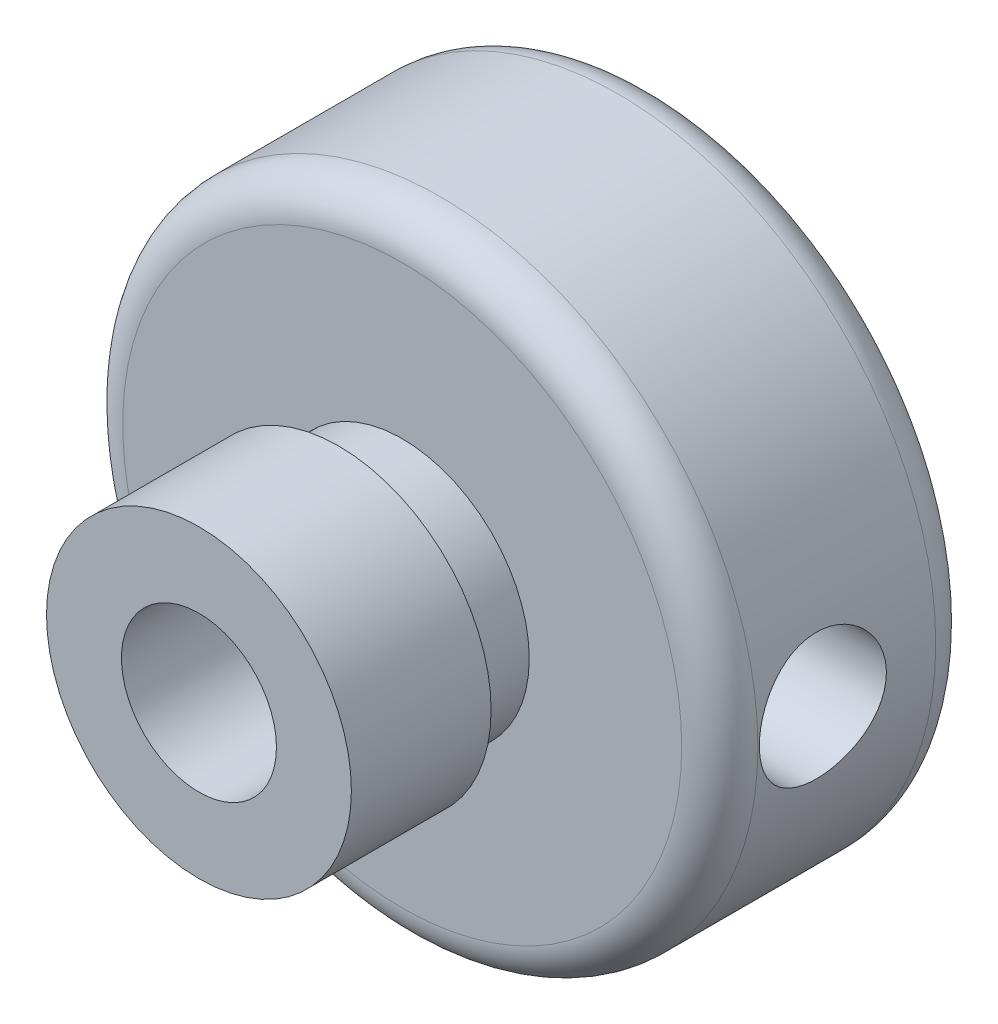
ISO-10303-21;
HEADER;
FILE_DESCRIPTION(('STEP AP214'),'2;1');
FILE_NAME('part.step','',(''),(''),'','','');
FILE_SCHEMA(('AUTOMOTIVE_DESIGN { 1 0 10303 214 1 1 1 1 }'));
ENDSEC;
DATA;
#1=APPLICATION_CONTEXT('core data for automotive mechanical design processes');
#2=APPLICATION_PROTOCOL_DEFINITION('international standard','automotive_design',2000,#1);
#3=PRODUCT_CONTEXT('',#1,'mechanical');
#4=PRODUCT('Part','Part','',(#3));
#5=PRODUCT_RELATED_PRODUCT_CATEGORY('part','',(#4));
#6=PRODUCT_DEFINITION_FORMATION('','',#4);
#7=PRODUCT_DEFINITION_CONTEXT('part definition',#1,'design');
#8=PRODUCT_DEFINITION('design','',#6,#7);
#9=PRODUCT_DEFINITION_SHAPE('','',#8);
#10=(LENGTH_UNIT() NAMED_UNIT(*) SI_UNIT(.MILLI.,.METRE.));
#11=(NAMED_UNIT(*) PLANE_ANGLE_UNIT() SI_UNIT($,.RADIAN.));
#12=(NAMED_UNIT(*) SI_UNIT($,.STERADIAN.) SOLID_ANGLE_UNIT());
#13=UNCERTAINTY_MEASURE_WITH_UNIT(LENGTH_MEASURE(1.E-05),#10,'distance_accuracy_value','');
#14=(GEOMETRIC_REPRESENTATION_CONTEXT(3) GLOBAL_UNCERTAINTY_ASSIGNED_CONTEXT((#13)) GLOBAL_UNIT_ASSIGNED_CONTEXT((#10,
#11,#12)) REPRESENTATION_CONTEXT('',''));
#15=CARTESIAN_POINT('',(0.,0.,0.));
#16=DIRECTION('',(0.,0.,1.));
#17=DIRECTION('',(1.,0.,0.));
#18=AXIS2_PLACEMENT_3D('',#15,#16,#17);
#19=CARTESIAN_POINT('',(0.,0.,0.));
#20=DIRECTION('',(0.,0.,1.));
#21=DIRECTION('',(1.,0.,0.));
#22=AXIS2_PLACEMENT_3D('',#19,#20,#21);
#23=CYLINDRICAL_SURFACE('',#22,3.05);
#24=CARTESIAN_POINT('',(0.,0.,18.));
#25=DIRECTION('',(0.,0.,1.));
#26=DIRECTION('',(1.,0.,0.));
#27=AXIS2_PLACEMENT_3D('',#24,#25,#26);
#28=CIRCLE('',#27,3.05);
#29=CARTESIAN_POINT('',(3.05,0.,18.));
#30=VERTEX_POINT('',#29);
#31=EDGE_CURVE('E133',#30,#30,#28,.T.);
#32=ORIENTED_EDGE('',*,*,#31,.T.);
#33=EDGE_LOOP('',(#32));
#34=FACE_BOUND('',#33,.T.);
#35=CARTESIAN_POINT('',(0.,0.,8.00000000000001));
#36=DIRECTION('',(0.,0.,-1.));
#37=DIRECTION('',(-1.,0.,0.));
#38=AXIS2_PLACEMENT_3D('',#35,#36,#37);
#39=CIRCLE('',#38,3.05);
#40=CARTESIAN_POINT('',(-3.05,0.,8.00000000000001));
#41=VERTEX_POINT('',#40);
#42=EDGE_CURVE('E132',#41,#41,#39,.F.);
#43=ORIENTED_EDGE('',*,*,#42,.F.);
#44=EDGE_LOOP('',(#43));
#45=FACE_BOUND('',#44,.T.);
#46=ADVANCED_FACE('F33',(#34,#45),#23,.F.);
#47=CARTESIAN_POINT('',(0.,0.,9.99999999999998));
#48=DIRECTION('',(0.,0.,-1.));
#49=DIRECTION('',(-1.,0.,0.));
#50=AXIS2_PLACEMENT_3D('',#47,#48,#49);
#51=CYLINDRICAL_SURFACE('',#50,12.5);
#52=CARTESIAN_POINT('',(12.5,0.,3.44238683127573));
#53=CARTESIAN_POINT('',(12.4999974395217,-0.138942266981648,3.4423919425216));
#54=CARTESIAN_POINT('',(12.4976596294558,-0.27794915050388,3.45400893869483));
#55=CARTESIAN_POINT('',(12.4885591405808,-0.552033769222637,3.50013308156382));
#56=CARTESIAN_POINT('',(12.4817929465046,-0.687108293853483,3.53465841327949));
#57=CARTESIAN_POINT('',(12.4645912319571,-0.949325763158384,3.6254900153277));
#58=CARTESIAN_POINT('',(12.4541592269179,-1.07647616983294,3.68177542338744));
#59=CARTESIAN_POINT('',(12.4307599508829,-1.31951997216066,3.81446745005396));
#60=CARTESIAN_POINT('',(12.4177928308927,-1.43541403768961,3.89087287029375));
#61=CARTESIAN_POINT('',(12.3905541332493,-1.65423369328724,4.06273306700431));
#62=CARTESIAN_POINT('',(12.3762686376087,-1.75698487789641,4.1584077197537));
#63=CARTESIAN_POINT('',(12.3481045113147,-1.94509189152012,4.36561787225496));
#64=CARTESIAN_POINT('',(12.3342259125106,-2.03044636192605,4.47715460961353));
#65=CARTESIAN_POINT('',(12.3083110453154,-2.18207938336905,4.71417731380543));
#66=CARTESIAN_POINT('',(12.2962926841237,-2.24817734716474,4.8397809407666));
#67=CARTESIAN_POINT('',(12.2756567014604,-2.35826416645085,5.10059137878589));
#68=CARTESIAN_POINT('',(12.267038744049,-2.40225520609312,5.23579723964158));
#69=CARTESIAN_POINT('',(12.2543201313051,-2.46631324971209,5.51009774104552));
#70=CARTESIAN_POINT('',(12.2501617526797,-2.48668624489703,5.64911819163129));
#71=CARTESIAN_POINT('',(12.2466593765157,-2.50388031931538,5.92866138468657));
#72=CARTESIAN_POINT('',(12.247314886696,-2.50070380678376,6.06918397207609));
#73=CARTESIAN_POINT('',(12.2533137787046,-2.47113643275455,6.34550380132824));
#74=CARTESIAN_POINT('',(12.2585863214691,-2.44509635060982,6.48134034534402));
#75=CARTESIAN_POINT('',(12.273113654,-2.37109471155772,6.74667702293324));
#76=CARTESIAN_POINT('',(12.2823686339444,-2.32313210775179,6.87617685357325));
#77=CARTESIAN_POINT('',(12.3038904625101,-2.20631195918688,7.12617498553472));
#78=CARTESIAN_POINT('',(12.3161772453426,-2.13731537808036,7.24660653019865));
#79=CARTESIAN_POINT('',(12.3423654693266,-1.98048393643177,7.47431395620775));
#80=CARTESIAN_POINT('',(12.3562670959592,-1.89264691089215,7.58158832340361));
#81=CARTESIAN_POINT('',(12.3844255310366,-1.69874983640153,7.78196033741805));
#82=CARTESIAN_POINT('',(12.3986842302727,-1.59239040303118,7.87476825092353));
#83=CARTESIAN_POINT('',(12.4257212178602,-1.3654625601551,8.04127144702878));
#84=CARTESIAN_POINT('',(12.4384994872243,-1.24489396844856,8.11496648450968));
#85=CARTESIAN_POINT('',(12.4611672540221,-0.992648467197394,8.24120560434066));
#86=CARTESIAN_POINT('',(12.4710522212068,-0.86095454896334,8.29371656538705));
#87=CARTESIAN_POINT('',(12.4867852246965,-0.590372441121754,8.37578801637212));
#88=CARTESIAN_POINT('',(12.4926337500133,-0.451485125181218,8.40535128645978));
#89=CARTESIAN_POINT('',(12.4995667966717,-0.172948514067973,8.44027796576141));
#90=CARTESIAN_POINT('',(12.5007293663117,-0.0333508208140364,8.44603788012638));
#91=CARTESIAN_POINT('',(12.4983762982526,0.244812335481695,8.43426218392026));
#92=CARTESIAN_POINT('',(12.4948609235362,0.383377856109397,8.41672788289424));
#93=CARTESIAN_POINT('',(12.4835958002005,0.654264149866276,8.35919089741583));
#94=CARTESIAN_POINT('',(12.4758844101052,0.786629870849685,8.31939166003094));
#95=CARTESIAN_POINT('',(12.4570888015258,1.04280906874913,8.21867687463618));
#96=CARTESIAN_POINT('',(12.4460043303557,1.16662190409383,8.15775974458364));
#97=CARTESIAN_POINT('',(12.4214977883324,1.40385293421552,8.01568060464743));
#98=CARTESIAN_POINT('',(12.4080487609263,1.51712531688042,7.93427987867833));
#99=CARTESIAN_POINT('',(12.3803683707471,1.72854504779794,7.75386385325749));
#100=CARTESIAN_POINT('',(12.3661369242097,1.82669077232684,7.65484666527605));
#101=CARTESIAN_POINT('',(12.3382325889241,2.00660147693537,7.44020345154792));
#102=CARTESIAN_POINT('',(12.3245715058326,2.08809425612156,7.32434747072237));
#103=CARTESIAN_POINT('',(12.2996047949048,2.23046355012793,7.08035842788401));
#104=CARTESIAN_POINT('',(12.2882990728335,2.29134088980717,6.95222585734183));
#105=CARTESIAN_POINT('',(12.2694185146095,2.39037960395481,6.68796621590185));
#106=CARTESIAN_POINT('',(12.2618243718046,2.42865874947754,6.55188472824992));
#107=CARTESIAN_POINT('',(12.2511859198007,2.48177162906791,6.27505319754846));
#108=CARTESIAN_POINT('',(12.2481410172778,2.49660842056272,6.13430376575236));
#109=CARTESIAN_POINT('',(12.2469787407845,2.50230227716861,5.85486466991494));
#110=CARTESIAN_POINT('',(12.2487729797326,2.49358947017717,5.71618395895821));
#111=CARTESIAN_POINT('',(12.2568893371153,2.45338076025007,5.44230770651316));
#112=CARTESIAN_POINT('',(12.2632114191791,2.42188504032317,5.3071121370387));
#113=CARTESIAN_POINT('',(12.2796316054789,2.33719642124731,5.04431755317436));
#114=CARTESIAN_POINT('',(12.2897205254707,2.28405626679328,4.9167009300197));
#115=CARTESIAN_POINT('',(12.3125428743543,2.15763661150396,4.67212752943964));
#116=CARTESIAN_POINT('',(12.3252765249724,2.0843554219372,4.55517164696288));
#117=CARTESIAN_POINT('',(12.3522240130806,1.91826478696603,4.33309790089994));
#118=CARTESIAN_POINT('',(12.3664593227424,1.82514471808791,4.22821491810676));
#119=CARTESIAN_POINT('',(12.3946520467989,1.62266092253281,4.03542131745282));
#120=CARTESIAN_POINT('',(12.4086093965798,1.51329346788332,3.94751460548254));
#121=CARTESIAN_POINT('',(12.4348458096994,1.28004407272061,3.79030022140959));
#122=CARTESIAN_POINT('',(12.4471057804812,1.15602221107455,3.72119682307565));
#123=CARTESIAN_POINT('',(12.4683781271249,0.89791590235177,3.60492152478425));
#124=CARTESIAN_POINT('',(12.4773934284653,0.763840652157748,3.55772985744451));
#125=CARTESIAN_POINT('',(12.4894093148842,0.524553722309381,3.49575696116394));
#126=CARTESIAN_POINT('',(12.4933575789613,0.4207041600344,3.47577884700632));
#127=CARTESIAN_POINT('',(12.4986538534973,0.211248813025111,3.4490920503798));
#128=CARTESIAN_POINT('',(12.5000019468288,0.105643084371492,3.44238294500131));
#129=CARTESIAN_POINT('',(12.5,0.,3.44238683127573));
#130=B_SPLINE_CURVE_WITH_KNOTS('',3,(#52,#53,#54,#55,#56,#57,#58,#59,#60,#61,#62,#63,#64,#65,
#66,#67,#68,#69,#70,#71,#72,#73,#74,#75,#76,#77,#78,#79,#80,#81,#82,#83,#84,#85,#86,#87,#88,#89,
#90,#91,#92,#93,#94,#95,#96,#97,#98,#99,#100,#101,#102,#103,#104,#105,#106,#107,#108,#109,#110,
#111,#112,#113,#114,#115,#116,#117,#118,#119,#120,#121,#122,#123,#124,#125,#126,#127,#128,#129),
.UNSPECIFIED.,.T.,.F.,(4,2,2,2,2,2,2,2,2,2,2,2,2,2,2,2,2,2,2,2,2,2,2,2,2,2,2,2,2,2,2,2,2,2,2,2,
2,2,4),(0.,0.416440326653169,0.833211626728356,1.2495843381259,1.6659322555772,2.08733167528047,
2.50876399186839,2.93402987514806,3.35925373412994,3.77890462758968,4.19851260703064,
4.61179317515696,5.02509348134323,5.4411872550898,5.85732886874176,6.28095631228376,
6.70458918849548,7.12888187135057,7.55312314245087,7.9702683919066,8.38739019144667,
8.8007613487681,9.21416348040061,9.63262665083399,10.0511347086482,10.4760157144806,
10.9008797180867,11.3235095258181,11.7460842082603,12.1609930641925,12.5758985873152,
12.9897990313277,13.4037341895466,13.8247019059785,14.2457663633232,14.6712374168909,
15.096323887938,15.4129693822473,15.7296047842749),.UNSPECIFIED.);
#131=CARTESIAN_POINT('',(12.5,0.,3.44238683127573));
#132=VERTEX_POINT('',#131);
#133=EDGE_CURVE('E111',#132,#132,#130,.T.);
#134=ORIENTED_EDGE('',*,*,#133,.T.);
#135=EDGE_LOOP('',(#134));
#136=FACE_BOUND('',#135,.T.);
#137=CARTESIAN_POINT('',(0.,0.,8.50000000000001));
#138=DIRECTION('',(0.,0.,1.));
#139=DIRECTION('',(1.,0.,0.));
#140=AXIS2_PLACEMENT_3D('',#137,#138,#139);
#141=CIRCLE('',#140,12.5);
#142=CARTESIAN_POINT('',(12.5,0.,8.50000000000001));
#143=VERTEX_POINT('',#142);
#144=EDGE_CURVE('E150',#143,#143,#141,.F.);
#145=ORIENTED_EDGE('',*,*,#144,.T.);
#146=EDGE_LOOP('',(#145));
#147=FACE_BOUND('',#146,.T.);
#148=CARTESIAN_POINT('',(0.,0.,1.5));
#149=DIRECTION('',(0.,0.,1.));
#150=DIRECTION('',(1.,0.,0.));
#151=AXIS2_PLACEMENT_3D('',#148,#149,#150);
#152=CIRCLE('',#151,12.5);
#153=CARTESIAN_POINT('',(12.5,0.,1.5));
#154=VERTEX_POINT('',#153);
#155=EDGE_CURVE('E147',#154,#154,#152,.T.);
#156=ORIENTED_EDGE('',*,*,#155,.T.);
#157=EDGE_LOOP('',(#156));
#158=FACE_BOUND('',#157,.T.);
#159=ADVANCED_FACE('F35',(#136,#147,#158),#51,.T.);
#160=CARTESIAN_POINT('',(0.,0.,9.99999999999998));
#161=DIRECTION('',(0.,0.,1.));
#162=DIRECTION('',(1.,0.,0.));
#163=AXIS2_PLACEMENT_3D('',#160,#161,#162);
#164=PLANE('',#163);
#165=CARTESIAN_POINT('',(0.,0.,9.99999999999998));
#166=DIRECTION('',(0.,0.,1.));
#167=DIRECTION('',(1.,0.,0.));
#168=AXIS2_PLACEMENT_3D('',#165,#166,#167);
#169=CIRCLE('',#168,11.);
#170=CARTESIAN_POINT('',(11.,0.,9.99999999999998));
#171=VERTEX_POINT('',#170);
#172=EDGE_CURVE('E139',#171,#171,#169,.T.);
#173=ORIENTED_EDGE('',*,*,#172,.T.);
#174=EDGE_LOOP('',(#173));
#175=FACE_BOUND('',#174,.T.);
#176=CARTESIAN_POINT('',(0.,0.,9.99999999999998));
#177=DIRECTION('',(0.,0.,1.));
#178=DIRECTION('',(1.,0.,0.));
#179=AXIS2_PLACEMENT_3D('',#176,#177,#178);
#180=CIRCLE('',#179,5.);
#181=CARTESIAN_POINT('',(5.,0.,9.99999999999998));
#182=VERTEX_POINT('',#181);
#183=EDGE_CURVE('E117',#182,#182,#180,.T.);
#184=ORIENTED_EDGE('',*,*,#183,.F.);
#185=EDGE_LOOP('',(#184));
#186=FACE_BOUND('',#185,.T.);
#187=ADVANCED_FACE('F164',(#175,#186),#164,.T.);
#188=CARTESIAN_POINT('',(0.,0.,0.));
#189=DIRECTION('',(0.,0.,1.));
#190=DIRECTION('',(1.,0.,0.));
#191=AXIS2_PLACEMENT_3D('',#188,#189,#190);
#192=PLANE('',#191);
#193=CARTESIAN_POINT('',(0.,0.,0.));
#194=DIRECTION('',(0.,0.,1.));
#195=DIRECTION('',(1.,0.,0.));
#196=AXIS2_PLACEMENT_3D('',#193,#194,#195);
#197=CIRCLE('',#196,11.);
#198=CARTESIAN_POINT('',(11.,0.,0.));
#199=VERTEX_POINT('',#198);
#200=EDGE_CURVE('E79',#199,#199,#197,.F.);
#201=ORIENTED_EDGE('',*,*,#200,.T.);
#202=EDGE_LOOP('',(#201));
#203=FACE_BOUND('',#202,.T.);
#204=CARTESIAN_POINT('',(0.,0.,0.));
#205=DIRECTION('',(0.,0.,-1.));
#206=DIRECTION('',(-1.,0.,0.));
#207=AXIS2_PLACEMENT_3D('',#204,#205,#206);
#208=CIRCLE('',#207,5.);
#209=CARTESIAN_POINT('',(-5.,0.,0.));
#210=VERTEX_POINT('',#209);
#211=EDGE_CURVE('E126',#210,#210,#208,.T.);
#212=ORIENTED_EDGE('',*,*,#211,.F.);
#213=EDGE_LOOP('',(#212));
#214=FACE_BOUND('',#213,.T.);
#215=ADVANCED_FACE('F155',(#203,#214),#192,.F.);
#216=CARTESIAN_POINT('',(0.,0.,18.));
#217=DIRECTION('',(0.,0.,-1.));
#218=DIRECTION('',(-1.,0.,0.));
#219=AXIS2_PLACEMENT_3D('',#216,#217,#218);
#220=CYLINDRICAL_SURFACE('',#219,6.);
#221=CARTESIAN_POINT('',(0.,0.,12.4999999999999));
#222=DIRECTION('',(0.,0.,1.));
#223=DIRECTION('',(1.,0.,0.));
#224=AXIS2_PLACEMENT_3D('',#221,#222,#223);
#225=CIRCLE('',#224,6.);
#226=CARTESIAN_POINT('',(6.,0.,12.4999999999999));
#227=VERTEX_POINT('',#226);
#228=EDGE_CURVE('E125',#227,#227,#225,.T.);
#229=ORIENTED_EDGE('',*,*,#228,.T.);
#230=EDGE_LOOP('',(#229));
#231=FACE_BOUND('',#230,.T.);
#232=CARTESIAN_POINT('',(0.,0.,18.));
#233=DIRECTION('',(0.,0.,1.));
#234=DIRECTION('',(1.,0.,0.));
#235=AXIS2_PLACEMENT_3D('',#232,#233,#234);
#236=CIRCLE('',#235,6.);
#237=CARTESIAN_POINT('',(6.,0.,18.));
#238=VERTEX_POINT('',#237);
#239=EDGE_CURVE('E136',#238,#238,#236,.T.);
#240=ORIENTED_EDGE('',*,*,#239,.F.);
#241=EDGE_LOOP('',(#240));
#242=FACE_BOUND('',#241,.T.);
#243=ADVANCED_FACE('F174',(#231,#242),#220,.T.);
#244=CARTESIAN_POINT('',(0.,0.,18.));
#245=DIRECTION('',(0.,0.,1.));
#246=DIRECTION('',(1.,0.,0.));
#247=AXIS2_PLACEMENT_3D('',#244,#245,#246);
#248=PLANE('',#247);
#249=ORIENTED_EDGE('',*,*,#31,.F.);
#250=EDGE_LOOP('',(#249));
#251=FACE_BOUND('',#250,.T.);
#252=ORIENTED_EDGE('',*,*,#239,.T.);
#253=EDGE_LOOP('',(#252));
#254=FACE_BOUND('',#253,.T.);
#255=ADVANCED_FACE('F176',(#251,#254),#248,.T.);
#256=CARTESIAN_POINT('',(0.,0.,8.00000000000001));
#257=DIRECTION('',(0.,0.,-1.));
#258=DIRECTION('',(-1.,0.,0.));
#259=AXIS2_PLACEMENT_3D('',#256,#257,#258);
#260=PLANE('',#259);
#261=DIRECTION('',(1.,0.,0.));
#262=VECTOR('',#261,1.);
#263=CARTESIAN_POINT('',(4.5,1.41993945219232,8.00000000000001));
#264=LINE('',#263,#262);
#265=CARTESIAN_POINT('',(4.5,1.41993945219232,8.00000000000001));
#266=VERTEX_POINT('',#265);
#267=CARTESIAN_POINT('',(4.79413933382283,1.41993945219238,8.00000000000001));
#268=VERTEX_POINT('',#267);
#269=EDGE_CURVE('E319',#266,#268,#264,.T.);
#270=ORIENTED_EDGE('',*,*,#269,.F.);
#271=DIRECTION('',(0.,-1.,0.));
#272=VECTOR('',#271,1.);
#273=CARTESIAN_POINT('',(4.5,0.,8.00000000000001));
#274=LINE('',#273,#272);
#275=CARTESIAN_POINT('',(4.5,-1.41993945219249,8.00000000000001));
#276=VERTEX_POINT('',#275);
#277=EDGE_CURVE('E84',#266,#276,#274,.T.);
#278=ORIENTED_EDGE('',*,*,#277,.T.);
#279=DIRECTION('',(1.,0.,0.));
#280=VECTOR('',#279,1.);
#281=CARTESIAN_POINT('',(4.5,-1.41993945219249,8.00000000000001));
#282=LINE('',#281,#280);
#283=CARTESIAN_POINT('',(4.79413933382283,-1.41993945219243,8.00000000000001));
#284=VERTEX_POINT('',#283);
#285=EDGE_CURVE('E118',#284,#276,#282,.F.);
#286=ORIENTED_EDGE('',*,*,#285,.F.);
#287=CARTESIAN_POINT('',(0.,0.,8.00000000000001));
#288=DIRECTION('',(0.,0.,-1.));
#289=DIRECTION('',(-1.,0.,0.));
#290=AXIS2_PLACEMENT_3D('',#287,#288,#289);
#291=CIRCLE('',#290,5.);
#292=EDGE_CURVE('E129',#284,#268,#291,.T.);
#293=ORIENTED_EDGE('',*,*,#292,.T.);
#294=EDGE_LOOP('',(#270,#278,#286,#293));
#295=FACE_BOUND('',#294,.T.);
#296=ORIENTED_EDGE('',*,*,#42,.T.);
#297=EDGE_LOOP('',(#296));
#298=FACE_BOUND('',#297,.T.);
#299=ADVANCED_FACE('F182',(#295,#298),#260,.T.);
#300=CARTESIAN_POINT('',(0.,0.,8.00000000000001));
#301=DIRECTION('',(0.,0.,-1.));
#302=DIRECTION('',(-1.,0.,0.));
#303=AXIS2_PLACEMENT_3D('',#300,#301,#302);
#304=CYLINDRICAL_SURFACE('',#303,5.);
#305=ORIENTED_EDGE('',*,*,#292,.F.);
#306=CARTESIAN_POINT('',(4.79413933382283,-1.41993945219243,8.00000000000001));
#307=CARTESIAN_POINT('',(4.77655996089363,-1.47930136138856,7.95902831162597));
#308=CARTESIAN_POINT('',(4.75834782199794,-1.53673101951034,7.91560960861672));
#309=CARTESIAN_POINT('',(4.721143881774,-1.64748584479761,7.82413006668995));
#310=CARTESIAN_POINT('',(4.70215215949917,-1.70081142656696,7.77606969779391));
#311=CARTESIAN_POINT('',(4.64461872469647,-1.8545888329379,7.62499668171361));
#312=CARTESIAN_POINT('',(4.60562720859515,-1.94849134138557,7.51533455784374));
#313=CARTESIAN_POINT('',(4.5308704763784,-2.11653142604829,7.28072575189006));
#314=CARTESIAN_POINT('',(4.49510759243868,-2.19065478936233,7.1557681723459));
#315=CARTESIAN_POINT('',(4.43150552427991,-2.31662578626772,6.89335805604076));
#316=CARTESIAN_POINT('',(4.40365267152933,-2.36851192576756,6.75592762153561));
#317=CARTESIAN_POINT('',(4.36133359504559,-2.44553191395606,6.47978817435404));
#318=CARTESIAN_POINT('',(4.34623305774842,-2.47194412070772,6.34153763239991));
#319=CARTESIAN_POINT('',(4.32953111809468,-2.50109478087086,6.06177643044486));
#320=CARTESIAN_POINT('',(4.32791972088577,-2.50385076253052,5.92026826217538));
#321=CARTESIAN_POINT('',(4.33780652479477,-2.48666036512744,5.65617140715459));
#322=CARTESIAN_POINT('',(4.34776549415118,-2.46938001912158,5.53333753232926));
#323=CARTESIAN_POINT('',(4.37697426521894,-2.41722577186984,5.29262366029399));
#324=CARTESIAN_POINT('',(4.39622663794526,-2.38234700190868,5.17474504376958));
#325=CARTESIAN_POINT('',(4.44228064590372,-2.29534360351904,4.94389742401077));
#326=CARTESIAN_POINT('',(4.46924874040473,-2.24283370207463,4.83110839806881));
#327=CARTESIAN_POINT('',(4.52770293359264,-2.12235364459484,4.61539960169002));
#328=CARTESIAN_POINT('',(4.55919108715103,-2.05437644867866,4.51248435568404));
#329=CARTESIAN_POINT('',(4.6279623483327,-1.89484063783592,4.30570720683528));
#330=CARTESIAN_POINT('',(4.66547398754844,-1.80138486859608,4.20337990069126));
#331=CARTESIAN_POINT('',(4.73882765359855,-1.59848434274939,4.01521191252292));
#332=CARTESIAN_POINT('',(4.77466887739855,-1.48903199842746,3.92937909936816));
#333=CARTESIAN_POINT('',(4.84267243066009,-1.25081753282907,3.77289954762644));
#334=CARTESIAN_POINT('',(4.87458726092079,-1.12139556334426,3.70314102707601));
#335=CARTESIAN_POINT('',(4.9290357592232,-0.850653060511766,3.58695916576692));
#336=CARTESIAN_POINT('',(4.95157688195922,-0.709342090169062,3.54051727570984));
#337=CARTESIAN_POINT('',(4.98315387065334,-0.431389758702875,3.47610663036502));
#338=CARTESIAN_POINT('',(4.99315413157227,-0.295331898241388,3.45609721322712));
#339=CARTESIAN_POINT('',(5.00182731982083,-0.0214421813139338,3.43872111839822));
#340=CARTESIAN_POINT('',(5.0005056051383,0.116388805208955,3.44134373037786));
#341=CARTESIAN_POINT('',(4.98724343648286,0.378560283538686,3.46797676110343));
#342=CARTESIAN_POINT('',(4.97613341908256,0.503118771528134,3.49031478747816));
#343=CARTESIAN_POINT('',(4.94548596943433,0.746468645191576,3.55312318238088));
#344=CARTESIAN_POINT('',(4.92594760671373,0.865259392507002,3.59359555292375));
#345=CARTESIAN_POINT('',(4.87951119512701,1.09764396561873,3.69258879943121));
#346=CARTESIAN_POINT('',(4.85241826962095,1.21099127968085,3.7515936935675));
#347=CARTESIAN_POINT('',(4.79348089999764,1.42655099046976,3.88543106072513));
#348=CARTESIAN_POINT('',(4.76163443179456,1.52875861161817,3.96027028178884));
#349=CARTESIAN_POINT('',(4.6925715812725,1.72978202281075,4.13213393176063));
#350=CARTESIAN_POINT('',(4.65513498858669,1.8272788026068,4.23061535752732));
#351=CARTESIAN_POINT('',(4.58142133300636,2.00495649063844,4.44262087335488));
#352=CARTESIAN_POINT('',(4.54514508506746,2.08512544691572,4.55615525973682));
#353=CARTESIAN_POINT('',(4.47615580421371,2.22951771875264,4.80198066415585));
#354=CARTESIAN_POINT('',(4.44369984523294,2.29278268772606,4.93491314099942));
#355=CARTESIAN_POINT('',(4.38926462411453,2.39536604570961,5.21168285263222));
#356=CARTESIAN_POINT('',(4.36727194074993,2.43471512967435,5.35550584203558));
#357=CARTESIAN_POINT('',(4.33899980801872,2.48471969949181,5.63519512193249));
#358=CARTESIAN_POINT('',(4.33141395946824,2.49776825783791,5.77049873316401));
#359=CARTESIAN_POINT('',(4.32914579147423,2.50170219302493,6.04150658505763));
#360=CARTESIAN_POINT('',(4.33445739549848,2.49259800695097,6.17721060698064));
#361=CARTESIAN_POINT('',(4.35599736827808,2.45472539499754,6.43154464745475));
#362=CARTESIAN_POINT('',(4.37113780826994,2.42791243747786,6.55056984262872));
#363=CARTESIAN_POINT('',(4.40935464690249,2.35779046129421,6.78232252091847));
#364=CARTESIAN_POINT('',(4.43243483369635,2.31447356733144,6.89504696796977));
#365=CARTESIAN_POINT('',(4.48582781804821,2.20930852901369,7.11938925933713));
#366=CARTESIAN_POINT('',(4.51652371144827,2.14640672235442,7.23041859416814));
#367=CARTESIAN_POINT('',(4.58103434605989,2.00503126863855,7.44103097492827));
#368=CARTESIAN_POINT('',(4.61484884860428,1.92655881267535,7.54061489546691));
#369=CARTESIAN_POINT('',(4.67365734527812,1.77806528373685,7.70226257896116));
#370=CARTESIAN_POINT('',(4.6986327314229,1.71124747774745,7.76730687435642));
#371=CARTESIAN_POINT('',(4.74747824236433,1.57067077105852,7.88960314018511));
#372=CARTESIAN_POINT('',(4.77135011922648,1.4969234797322,7.9468677640529));
#373=CARTESIAN_POINT('',(4.79413933382283,1.41993945219238,8.00000000000001));
#374=B_SPLINE_CURVE_WITH_KNOTS('',3,(#306,#307,#308,#309,#310,#311,#312,#313,#314,#315,#316,
#317,#318,#319,#320,#321,#322,#323,#324,#325,#326,#327,#328,#329,#330,#331,#332,#333,#334,#335,
#336,#337,#338,#339,#340,#341,#342,#343,#344,#345,#346,#347,#348,#349,#350,#351,#352,#353,#354,
#355,#356,#357,#358,#359,#360,#361,#362,#363,#364,#365,#366,#367,#368,#369,#370,#371,#372,#373),
.UNSPECIFIED.,.F.,.F.,(4,2,2,2,2,2,2,2,2,2,2,2,2,2,2,2,2,2,2,2,2,2,2,2,2,2,2,2,2,2,2,2,2,4),(0.,
0.222567600233416,0.445112686548235,0.891504494474118,1.33821621212195,1.78415124878526,
2.20632081047659,2.62817753560224,2.99976672751474,3.37145877834111,3.75186790205284,
4.13245051511619,4.56129004663798,4.99033365539287,5.43926245129232,5.88783353848171,
6.29923089364334,6.71043357074821,7.08978529881313,7.4691789172815,7.85944575986678,
8.24987925689376,8.6786586442826,9.10773284733471,9.55755210160726,10.0067928073695,
10.4128824256009,10.8187807550647,11.1860200907616,11.5534348845389,11.9456549713418,
12.3378450664106,12.626911638641,12.9155022740539),.UNSPECIFIED.);
#375=CARTESIAN_POINT('',(4.5,-2.1794494717704,7.16713170266731));
#376=VERTEX_POINT('',#375);
#377=EDGE_CURVE('E11',#284,#376,#374,.T.);
#378=ORIENTED_EDGE('',*,*,#377,.T.);
#379=DIRECTION('',(0.,0.,-1.));
#380=VECTOR('',#379,1.);
#381=CARTESIAN_POINT('',(4.5,-2.1794494717704,8.00000000000001));
#382=LINE('',#381,#380);
#383=CARTESIAN_POINT('',(4.5,-2.1794494717704,4.71764195988414));
#384=VERTEX_POINT('',#383);
#385=EDGE_CURVE('E38',#384,#376,#382,.F.);
#386=ORIENTED_EDGE('',*,*,#385,.F.);
#387=CARTESIAN_POINT('',(4.5,2.17944947177029,4.71764195988414));
#388=VERTEX_POINT('',#387);
#389=EDGE_CURVE('E43',#384,#388,#374,.T.);
#390=ORIENTED_EDGE('',*,*,#389,.T.);
#391=DIRECTION('',(0.,0.,-1.));
#392=VECTOR('',#391,1.);
#393=CARTESIAN_POINT('',(4.5,2.17944947177029,8.00000000000001));
#394=LINE('',#393,#392);
#395=CARTESIAN_POINT('',(4.5,2.17944947177029,7.16713170266731));
#396=VERTEX_POINT('',#395);
#397=EDGE_CURVE('E74',#396,#388,#394,.T.);
#398=ORIENTED_EDGE('',*,*,#397,.F.);
#399=EDGE_CURVE('E44',#396,#268,#374,.T.);
#400=ORIENTED_EDGE('',*,*,#399,.T.);
#401=EDGE_LOOP('',(#305,#378,#386,#390,#398,#400));
#402=FACE_BOUND('',#401,.T.);
#403=ORIENTED_EDGE('',*,*,#211,.T.);
#404=EDGE_LOOP('',(#403));
#405=FACE_BOUND('',#404,.T.);
#406=ADVANCED_FACE('F90',(#402,#405),#304,.F.);
#407=CARTESIAN_POINT('',(0.,4.99999999999995,12.4999999999999));
#408=DIRECTION('',(0.,0.,1.));
#409=DIRECTION('',(1.,0.,0.));
#410=AXIS2_PLACEMENT_3D('',#407,#408,#409);
#411=PLANE('',#410);
#412=CARTESIAN_POINT('',(0.,0.,12.4999999999999));
#413=DIRECTION('',(0.,0.,1.));
#414=DIRECTION('',(1.,0.,0.));
#415=AXIS2_PLACEMENT_3D('',#412,#413,#414);
#416=CIRCLE('',#415,5.);
#417=CARTESIAN_POINT('',(5.,0.,12.4999999999999));
#418=VERTEX_POINT('',#417);
#419=EDGE_CURVE('E122',#418,#418,#416,.T.);
#420=ORIENTED_EDGE('',*,*,#419,.T.);
#421=EDGE_LOOP('',(#420));
#422=FACE_BOUND('',#421,.T.);
#423=ORIENTED_EDGE('',*,*,#228,.F.);
#424=EDGE_LOOP('',(#423));
#425=FACE_BOUND('',#424,.T.);
#426=ADVANCED_FACE('F200',(#422,#425),#411,.F.);
#427=CARTESIAN_POINT('',(0.,0.,21.3998267273121));
#428=DIRECTION('',(0.,0.,1.));
#429=DIRECTION('',(1.,0.,0.));
#430=AXIS2_PLACEMENT_3D('',#427,#428,#429);
#431=CYLINDRICAL_SURFACE('',#430,5.);
#432=ORIENTED_EDGE('',*,*,#183,.T.);
#433=EDGE_LOOP('',(#432));
#434=FACE_BOUND('',#433,.T.);
#435=ORIENTED_EDGE('',*,*,#419,.F.);
#436=EDGE_LOOP('',(#435));
#437=FACE_BOUND('',#436,.T.);
#438=ADVANCED_FACE('F205',(#434,#437),#431,.T.);
#439=CARTESIAN_POINT('',(0.,0.,8.50000000000001));
#440=DIRECTION('',(0.,0.,1.));
#441=DIRECTION('',(1.,0.,0.));
#442=AXIS2_PLACEMENT_3D('',#439,#440,#441);
#443=TOROIDAL_SURFACE('',#442,11.,1.5);
#444=ORIENTED_EDGE('',*,*,#144,.F.);
#445=EDGE_LOOP('',(#444));
#446=FACE_BOUND('',#445,.T.);
#447=ORIENTED_EDGE('',*,*,#172,.F.);
#448=EDGE_LOOP('',(#447));
#449=FACE_BOUND('',#448,.T.);
#450=ADVANCED_FACE('F160',(#446,#449),#443,.T.);
#451=CARTESIAN_POINT('',(0.,0.,1.5));
#452=DIRECTION('',(0.,0.,1.));
#453=DIRECTION('',(1.,0.,0.));
#454=AXIS2_PLACEMENT_3D('',#451,#452,#453);
#455=TOROIDAL_SURFACE('',#454,11.,1.5);
#456=ORIENTED_EDGE('',*,*,#200,.F.);
#457=EDGE_LOOP('',(#456));
#458=FACE_BOUND('',#457,.T.);
#459=ORIENTED_EDGE('',*,*,#155,.F.);
#460=EDGE_LOOP('',(#459));
#461=FACE_BOUND('',#460,.T.);
#462=ADVANCED_FACE('F106',(#458,#461),#455,.T.);
#463=CARTESIAN_POINT('',(4.5,0.,5.94238683127571));
#464=DIRECTION('',(1.,0.,0.));
#465=DIRECTION('',(0.,0.,-1.));
#466=AXIS2_PLACEMENT_3D('',#463,#464,#465);
#467=CYLINDRICAL_SURFACE('',#466,2.5);
#468=ORIENTED_EDGE('',*,*,#285,.T.);
#469=CARTESIAN_POINT('',(4.5,0.,5.94238683127571));
#470=DIRECTION('',(1.,0.,0.));
#471=DIRECTION('',(0.,0.,-1.));
#472=AXIS2_PLACEMENT_3D('',#469,#470,#471);
#473=CIRCLE('',#472,2.5);
#474=EDGE_CURVE('E85',#266,#276,#473,.T.);
#475=ORIENTED_EDGE('',*,*,#474,.F.);
#476=ORIENTED_EDGE('',*,*,#269,.T.);
#477=ORIENTED_EDGE('',*,*,#399,.F.);
#478=EDGE_CURVE('E50',#388,#396,#473,.T.);
#479=ORIENTED_EDGE('',*,*,#478,.F.);
#480=ORIENTED_EDGE('',*,*,#389,.F.);
#481=EDGE_CURVE('E87',#376,#384,#473,.T.);
#482=ORIENTED_EDGE('',*,*,#481,.F.);
#483=ORIENTED_EDGE('',*,*,#377,.F.);
#484=EDGE_LOOP('',(#468,#475,#476,#477,#479,#480,#482,#483));
#485=FACE_BOUND('',#484,.T.);
#486=ORIENTED_EDGE('',*,*,#133,.F.);
#487=EDGE_LOOP('',(#486));
#488=FACE_BOUND('',#487,.T.);
#489=ADVANCED_FACE('F81',(#485,#488),#467,.F.);
#490=CARTESIAN_POINT('',(4.5,0.,5.94238683127571));
#491=DIRECTION('',(1.,0.,0.));
#492=DIRECTION('',(0.,0.,-1.));
#493=AXIS2_PLACEMENT_3D('',#490,#491,#492);
#494=PLANE('',#493);
#495=ORIENTED_EDGE('',*,*,#385,.T.);
#496=ORIENTED_EDGE('',*,*,#481,.T.);
#497=EDGE_LOOP('',(#495,#496));
#498=FACE_BOUND('',#497,.T.);
#499=ADVANCED_FACE('F105',(#498),#494,.T.);
#500=ORIENTED_EDGE('',*,*,#397,.T.);
#501=ORIENTED_EDGE('',*,*,#478,.T.);
#502=EDGE_LOOP('',(#500,#501));
#503=FACE_BOUND('',#502,.T.);
#504=ADVANCED_FACE('F75',(#503),#494,.T.);
#505=ORIENTED_EDGE('',*,*,#474,.T.);
#506=ORIENTED_EDGE('',*,*,#277,.F.);
#507=EDGE_LOOP('',(#505,#506));
#508=FACE_BOUND('',#507,.T.);
#509=ADVANCED_FACE('F107',(#508),#494,.T.);
#510=CLOSED_SHELL('',(#46,#159,#187,#215,#243,#255,#299,#406,#426,#438,#450,#462,#489,#499,#504,#509));
#511=MANIFOLD_SOLID_BREP('B2',#510);
#512=ADVANCED_BREP_SHAPE_REPRESENTATION('',(#18,#511),#14);
#513=SHAPE_DEFINITION_REPRESENTATION(#9,#512);
ENDSEC;
END-ISO-10303-21;
